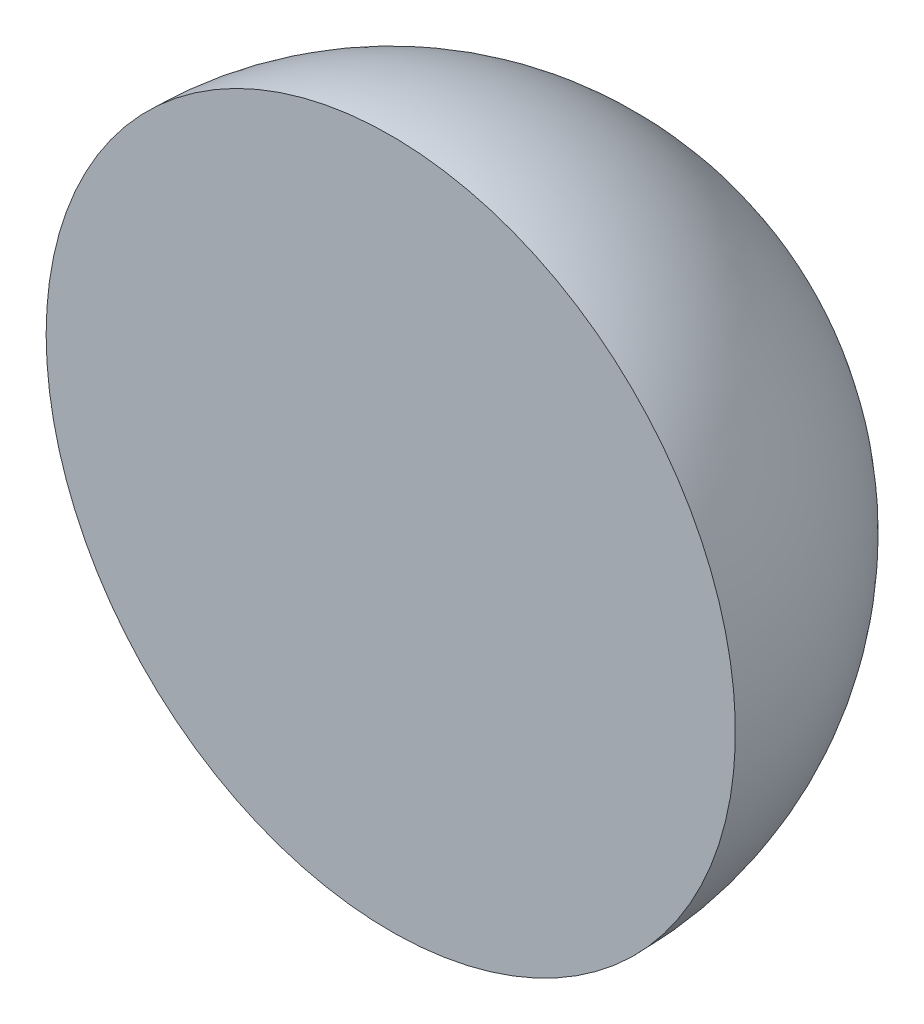
ISO-10303-21;
HEADER;
FILE_DESCRIPTION(('STEP AP214'),'2;1');
FILE_NAME('part.step','',(''),(''),'','','');
FILE_SCHEMA(('AUTOMOTIVE_DESIGN { 1 0 10303 214 1 1 1 1 }'));
ENDSEC;
DATA;
#1=APPLICATION_CONTEXT('core data for automotive mechanical design processes');
#2=APPLICATION_PROTOCOL_DEFINITION('international standard','automotive_design',2000,#1);
#3=PRODUCT_CONTEXT('',#1,'mechanical');
#4=PRODUCT('Part','Part','',(#3));
#5=PRODUCT_RELATED_PRODUCT_CATEGORY('part','',(#4));
#6=PRODUCT_DEFINITION_FORMATION('','',#4);
#7=PRODUCT_DEFINITION_CONTEXT('part definition',#1,'design');
#8=PRODUCT_DEFINITION('design','',#6,#7);
#9=PRODUCT_DEFINITION_SHAPE('','',#8);
#10=(LENGTH_UNIT() NAMED_UNIT(*) SI_UNIT(.MILLI.,.METRE.));
#11=(NAMED_UNIT(*) PLANE_ANGLE_UNIT() SI_UNIT($,.RADIAN.));
#12=(NAMED_UNIT(*) SI_UNIT($,.STERADIAN.) SOLID_ANGLE_UNIT());
#13=UNCERTAINTY_MEASURE_WITH_UNIT(LENGTH_MEASURE(1.E-05),#10,'distance_accuracy_value','');
#14=(GEOMETRIC_REPRESENTATION_CONTEXT(3) GLOBAL_UNCERTAINTY_ASSIGNED_CONTEXT((#13)) GLOBAL_UNIT_ASSIGNED_CONTEXT((#10,
#11,#12)) REPRESENTATION_CONTEXT('',''));
#15=CARTESIAN_POINT('',(0.,0.,0.));
#16=DIRECTION('',(0.,0.,1.));
#17=DIRECTION('',(1.,0.,0.));
#18=AXIS2_PLACEMENT_3D('',#15,#16,#17);
#19=CARTESIAN_POINT('',(26.9549842546585,10.3791818464208,0.));
#20=DIRECTION('',(0.,1.,0.));
#21=DIRECTION('',(-1.,0.,0.));
#22=AXIS2_PLACEMENT_3D('',#19,#20,#21);
#23=SPHERICAL_SURFACE('',#22,25.);
#24=CARTESIAN_POINT('',(26.9549842546585,10.3791818464208,0.));
#25=DIRECTION('',(0.,0.,-1.));
#26=DIRECTION('',(-1.,0.,0.));
#27=AXIS2_PLACEMENT_3D('',#24,#25,#26);
#28=SPHERICAL_SURFACE('',#27,25.);
#29=CARTESIAN_POINT('',(26.9549842546585,10.3791818464208,0.));
#30=DIRECTION('',(0.,0.,-1.));
#31=DIRECTION('',(-1.,0.,0.));
#32=AXIS2_PLACEMENT_3D('',#29,#30,#31);
#33=CIRCLE('',#32,25.);
#34=CARTESIAN_POINT('',(1.95498425465845,10.3791818464208,-1.74574066942157E-13));
#35=VERTEX_POINT('',#34);
#36=EDGE_CURVE('E10',#35,#35,#33,.T.);
#37=ORIENTED_EDGE('',*,*,#36,.T.);
#38=EDGE_LOOP('',(#37));
#39=FACE_BOUND('',#38,.T.);
#40=ADVANCED_FACE('F37',(#39),#28,.T.);
#41=CARTESIAN_POINT('',(26.9549842546585,10.3791818464208,0.));
#42=DIRECTION('',(0.,0.,-1.));
#43=DIRECTION('',(-1.,0.,0.));
#44=AXIS2_PLACEMENT_3D('',#41,#42,#43);
#45=PLANE('',#44);
#46=ORIENTED_EDGE('',*,*,#36,.F.);
#47=EDGE_LOOP('',(#46));
#48=FACE_BOUND('',#47,.T.);
#49=ADVANCED_FACE('F46',(#48),#45,.F.);
#50=CLOSED_SHELL('',(#40,#49));
#51=MANIFOLD_SOLID_BREP('B2',#50);
#52=ADVANCED_BREP_SHAPE_REPRESENTATION('',(#18,#51),#14);
#53=SHAPE_DEFINITION_REPRESENTATION(#9,#52);
ENDSEC;
END-ISO-10303-21;
